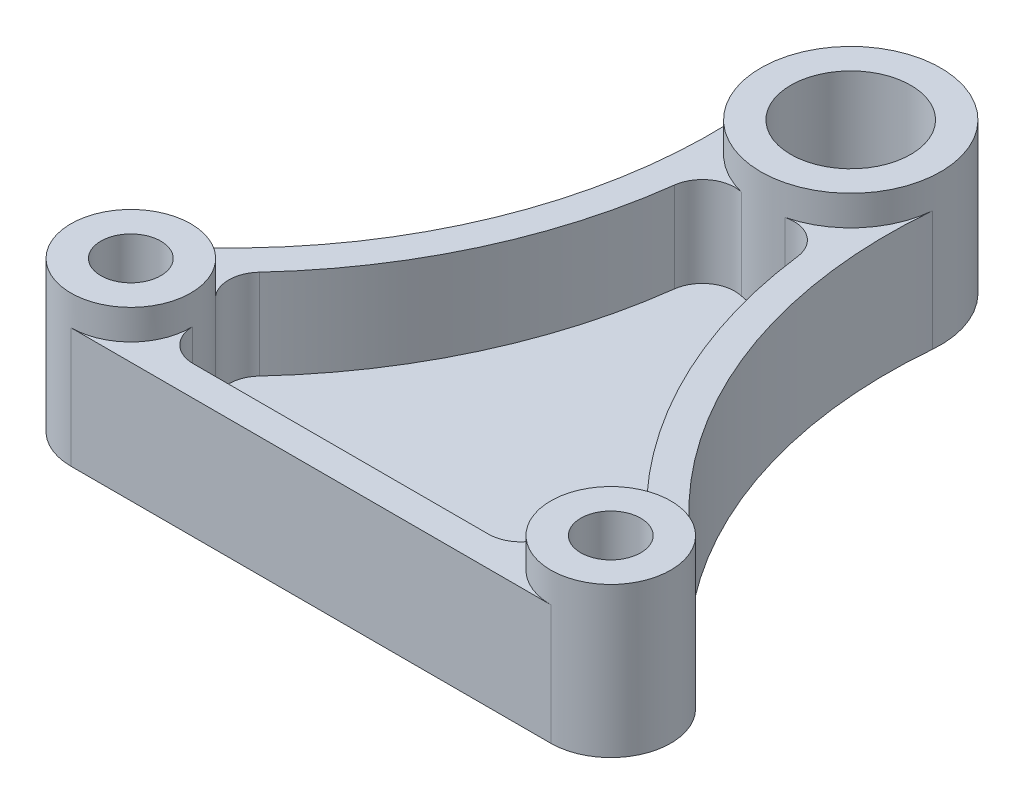
ISO-10303-21;
HEADER;
FILE_DESCRIPTION(('STEP AP214'),'2;1');
FILE_NAME('part.step','',(''),(''),'','','');
FILE_SCHEMA(('AUTOMOTIVE_DESIGN { 1 0 10303 214 1 1 1 1 }'));
ENDSEC;
DATA;
#1=APPLICATION_CONTEXT('core data for automotive mechanical design processes');
#2=APPLICATION_PROTOCOL_DEFINITION('international standard','automotive_design',2000,#1);
#3=PRODUCT_CONTEXT('',#1,'mechanical');
#4=PRODUCT('Part','Part','',(#3));
#5=PRODUCT_RELATED_PRODUCT_CATEGORY('part','',(#4));
#6=PRODUCT_DEFINITION_FORMATION('','',#4);
#7=PRODUCT_DEFINITION_CONTEXT('part definition',#1,'design');
#8=PRODUCT_DEFINITION('design','',#6,#7);
#9=PRODUCT_DEFINITION_SHAPE('','',#8);
#10=(LENGTH_UNIT() NAMED_UNIT(*) SI_UNIT(.MILLI.,.METRE.));
#11=(NAMED_UNIT(*) PLANE_ANGLE_UNIT() SI_UNIT($,.RADIAN.));
#12=(NAMED_UNIT(*) SI_UNIT($,.STERADIAN.) SOLID_ANGLE_UNIT());
#13=UNCERTAINTY_MEASURE_WITH_UNIT(LENGTH_MEASURE(1.E-05),#10,'distance_accuracy_value','');
#14=(GEOMETRIC_REPRESENTATION_CONTEXT(3) GLOBAL_UNCERTAINTY_ASSIGNED_CONTEXT((#13)) GLOBAL_UNIT_ASSIGNED_CONTEXT((#10,
#11,#12)) REPRESENTATION_CONTEXT('',''));
#15=CARTESIAN_POINT('',(0.,0.,0.));
#16=DIRECTION('',(0.,0.,1.));
#17=DIRECTION('',(1.,0.,0.));
#18=AXIS2_PLACEMENT_3D('',#15,#16,#17);
#19=CARTESIAN_POINT('',(-60.0847310703044,12.7,5.37872821484782));
#20=DIRECTION('',(0.,1.,0.));
#21=DIRECTION('',(0.,0.,1.));
#22=AXIS2_PLACEMENT_3D('',#19,#20,#21);
#23=PLANE('',#22);
#24=DIRECTION('',(1.,0.,0.));
#25=VECTOR('',#24,1.);
#26=CARTESIAN_POINT('',(-25.4,12.7,53.975));
#27=LINE('',#26,#25);
#28=CARTESIAN_POINT('',(-15.6242992578537,12.7,53.975));
#29=VERTEX_POINT('',#28);
#30=CARTESIAN_POINT('',(15.6242992578537,12.7,53.975));
#31=VERTEX_POINT('',#30);
#32=EDGE_CURVE('E311',#29,#31,#27,.T.);
#33=ORIENTED_EDGE('',*,*,#32,.F.);
#34=CARTESIAN_POINT('',(-15.6242992578537,12.7,50.546));
#35=DIRECTION('',(0.,1.,0.));
#36=DIRECTION('',(0.,0.,1.));
#37=AXIS2_PLACEMENT_3D('',#34,#35,#36);
#38=CIRCLE('',#37,3.429);
#39=CARTESIAN_POINT('',(-19.0521423752297,12.7,50.6350649350649));
#40=VERTEX_POINT('',#39);
#41=EDGE_CURVE('E292',#29,#40,#38,.F.);
#42=ORIENTED_EDGE('',*,*,#41,.T.);
#43=CARTESIAN_POINT('',(-25.4,12.7,50.8));
#44=DIRECTION('',(0.,1.,0.));
#45=DIRECTION('',(0.,0.,1.));
#46=AXIS2_PLACEMENT_3D('',#43,#44,#45);
#47=CIRCLE('',#46,6.35);
#48=CARTESIAN_POINT('',(-25.4,12.7,57.15));
#49=VERTEX_POINT('',#48);
#50=EDGE_CURVE('E346',#49,#40,#47,.T.);
#51=ORIENTED_EDGE('',*,*,#50,.F.);
#52=DIRECTION('',(1.,0.,0.));
#53=VECTOR('',#52,1.);
#54=CARTESIAN_POINT('',(-25.4,12.7,57.15));
#55=LINE('',#54,#53);
#56=CARTESIAN_POINT('',(25.4,12.7,57.15));
#57=VERTEX_POINT('',#56);
#58=EDGE_CURVE('E199',#49,#57,#55,.T.);
#59=ORIENTED_EDGE('',*,*,#58,.T.);
#60=CARTESIAN_POINT('',(25.4,12.7,50.8));
#61=DIRECTION('',(0.,1.,0.));
#62=DIRECTION('',(0.,0.,1.));
#63=AXIS2_PLACEMENT_3D('',#60,#61,#62);
#64=CIRCLE('',#63,6.35);
#65=CARTESIAN_POINT('',(19.0521423752297,12.7,50.6350649350649));
#66=VERTEX_POINT('',#65);
#67=EDGE_CURVE('E358',#57,#66,#64,.F.);
#68=ORIENTED_EDGE('',*,*,#67,.T.);
#69=CARTESIAN_POINT('',(15.6242992578537,12.7,50.546));
#70=DIRECTION('',(0.,1.,0.));
#71=DIRECTION('',(0.,0.,1.));
#72=AXIS2_PLACEMENT_3D('',#69,#70,#71);
#73=CIRCLE('',#72,3.429);
#74=EDGE_CURVE('E286',#66,#31,#73,.F.);
#75=ORIENTED_EDGE('',*,*,#74,.T.);
#76=EDGE_LOOP('',(#33,#42,#51,#59,#68,#75));
#77=FACE_BOUND('',#76,.T.);
#78=ADVANCED_FACE('F52',(#77),#23,.T.);
#79=CARTESIAN_POINT('',(60.0847310703044,12.7,5.37872821484781));
#80=DIRECTION('',(0.,1.,0.));
#81=DIRECTION('',(0.,0.,1.));
#82=AXIS2_PLACEMENT_3D('',#79,#80,#81);
#83=CIRCLE('',#82,53.975);
#84=CARTESIAN_POINT('',(20.509178492168,12.7,42.0812657720136));
#85=VERTEX_POINT('',#84);
#86=CARTESIAN_POINT('',(6.53487642210372,12.7,12.1399183583495));
#87=VERTEX_POINT('',#86);
#88=EDGE_CURVE('E300',#85,#87,#83,.F.);
#89=ORIENTED_EDGE('',*,*,#88,.F.);
#90=CARTESIAN_POINT('',(17.9949669166158,12.7,44.4129563932923));
#91=DIRECTION('',(0.,1.,0.));
#92=DIRECTION('',(0.,0.,1.));
#93=AXIS2_PLACEMENT_3D('',#90,#91,#92);
#94=CIRCLE('',#93,3.429);
#95=CARTESIAN_POINT('',(20.5915369588414,12.7,46.6525690865535));
#96=VERTEX_POINT('',#95);
#97=EDGE_CURVE('E296',#85,#96,#94,.F.);
#98=ORIENTED_EDGE('',*,*,#97,.T.);
#99=CARTESIAN_POINT('',(29.2538590078116,12.7,45.753192023872));
#100=VERTEX_POINT('',#99);
#101=EDGE_CURVE('E193',#96,#100,#64,.F.);
#102=ORIENTED_EDGE('',*,*,#101,.T.);
#103=CARTESIAN_POINT('',(60.0847310703044,12.7,5.37872821484781));
#104=DIRECTION('',(0.,-1.,0.));
#105=DIRECTION('',(0.,0.,1.));
#106=AXIS2_PLACEMENT_3D('',#103,#104,#105);
#107=CIRCLE('',#106,50.8);
#108=CARTESIAN_POINT('',(9.48706280057436,12.7,0.849272876028603));
#109=VERTEX_POINT('',#108);
#110=EDGE_CURVE('E189',#100,#109,#107,.T.);
#111=ORIENTED_EDGE('',*,*,#110,.T.);
#112=CARTESIAN_POINT('',(0.,12.7,0.));
#113=DIRECTION('',(0.,1.,0.));
#114=DIRECTION('',(0.,0.,1.));
#115=AXIS2_PLACEMENT_3D('',#112,#113,#114);
#116=CIRCLE('',#115,9.525);
#117=CARTESIAN_POINT('',(2.30359239427797,12.7,9.24224469926136));
#118=VERTEX_POINT('',#117);
#119=EDGE_CURVE('E68',#109,#118,#116,.F.);
#120=ORIENTED_EDGE('',*,*,#119,.T.);
#121=CARTESIAN_POINT('',(3.13288565621804,12.7,12.5694527909955));
#122=DIRECTION('',(0.,1.,0.));
#123=DIRECTION('',(0.,0.,1.));
#124=AXIS2_PLACEMENT_3D('',#121,#122,#123);
#125=CIRCLE('',#124,3.429);
#126=EDGE_CURVE('E61',#118,#87,#125,.F.);
#127=ORIENTED_EDGE('',*,*,#126,.T.);
#128=EDGE_LOOP('',(#89,#98,#102,#111,#120,#127));
#129=FACE_BOUND('',#128,.T.);
#130=ADVANCED_FACE('F191',(#129),#23,.T.);
#131=CARTESIAN_POINT('',(-60.0847310703044,12.7,5.37872821484782));
#132=DIRECTION('',(0.,1.,0.));
#133=DIRECTION('',(0.,0.,1.));
#134=AXIS2_PLACEMENT_3D('',#131,#132,#133);
#135=CIRCLE('',#134,53.975);
#136=CARTESIAN_POINT('',(-6.53487642210372,12.7,12.1399183583494));
#137=VERTEX_POINT('',#136);
#138=CARTESIAN_POINT('',(-20.509178492168,12.7,42.0812657720136));
#139=VERTEX_POINT('',#138);
#140=EDGE_CURVE('E442',#137,#139,#135,.F.);
#141=ORIENTED_EDGE('',*,*,#140,.F.);
#142=CARTESIAN_POINT('',(-3.13288565621804,12.7,12.5694527909954));
#143=DIRECTION('',(0.,1.,0.));
#144=DIRECTION('',(0.,0.,1.));
#145=AXIS2_PLACEMENT_3D('',#142,#143,#144);
#146=CIRCLE('',#145,3.429);
#147=CARTESIAN_POINT('',(-2.30359239427797,12.7,9.24224469926136));
#148=VERTEX_POINT('',#147);
#149=EDGE_CURVE('E12',#137,#148,#146,.F.);
#150=ORIENTED_EDGE('',*,*,#149,.T.);
#151=CARTESIAN_POINT('',(-9.48706280057436,12.7,0.849272876028608));
#152=VERTEX_POINT('',#151);
#153=EDGE_CURVE('E76',#148,#152,#116,.F.);
#154=ORIENTED_EDGE('',*,*,#153,.T.);
#155=CARTESIAN_POINT('',(-60.0847310703044,12.7,5.37872821484782));
#156=DIRECTION('',(0.,-1.,0.));
#157=DIRECTION('',(0.,0.,1.));
#158=AXIS2_PLACEMENT_3D('',#155,#156,#157);
#159=CIRCLE('',#158,50.8);
#160=CARTESIAN_POINT('',(-29.2538590078116,12.7,45.753192023872));
#161=VERTEX_POINT('',#160);
#162=EDGE_CURVE('E387',#152,#161,#159,.T.);
#163=ORIENTED_EDGE('',*,*,#162,.T.);
#164=CARTESIAN_POINT('',(-20.5915369588414,12.7,46.6525690865535));
#165=VERTEX_POINT('',#164);
#166=EDGE_CURVE('E352',#165,#161,#47,.T.);
#167=ORIENTED_EDGE('',*,*,#166,.F.);
#168=CARTESIAN_POINT('',(-17.9949669166158,12.7,44.4129563932923));
#169=DIRECTION('',(0.,1.,0.));
#170=DIRECTION('',(0.,0.,1.));
#171=AXIS2_PLACEMENT_3D('',#168,#169,#170);
#172=CIRCLE('',#171,3.429);
#173=EDGE_CURVE('E289',#165,#139,#172,.F.);
#174=ORIENTED_EDGE('',*,*,#173,.T.);
#175=EDGE_LOOP('',(#141,#150,#154,#163,#167,#174));
#176=FACE_BOUND('',#175,.T.);
#177=ADVANCED_FACE('F472',(#176),#23,.T.);
#178=CARTESIAN_POINT('',(-60.0847310703044,12.7,5.37872821484782));
#179=DIRECTION('',(0.,-1.,0.));
#180=DIRECTION('',(0.,0.,-1.));
#181=AXIS2_PLACEMENT_3D('',#178,#179,#180);
#182=CYLINDRICAL_SURFACE('',#181,50.8);
#183=CARTESIAN_POINT('',(-60.0847310703044,0.,5.37872821484782));
#184=DIRECTION('',(0.,-1.,0.));
#185=DIRECTION('',(0.,0.,1.));
#186=AXIS2_PLACEMENT_3D('',#183,#184,#185);
#187=CIRCLE('',#186,50.8);
#188=CARTESIAN_POINT('',(-9.48706280057436,0.,0.849272876028608));
#189=VERTEX_POINT('',#188);
#190=CARTESIAN_POINT('',(-29.2538590078116,0.,45.753192023872));
#191=VERTEX_POINT('',#190);
#192=EDGE_CURVE('E371',#189,#191,#187,.T.);
#193=ORIENTED_EDGE('',*,*,#192,.T.);
#194=DIRECTION('',(0.,-1.,0.));
#195=VECTOR('',#194,1.);
#196=CARTESIAN_POINT('',(-29.2538590078116,12.7,45.753192023872));
#197=LINE('',#196,#195);
#198=EDGE_CURVE('E222',#161,#191,#197,.T.);
#199=ORIENTED_EDGE('',*,*,#198,.F.);
#200=ORIENTED_EDGE('',*,*,#162,.F.);
#201=DIRECTION('',(0.,-1.,0.));
#202=VECTOR('',#201,1.);
#203=CARTESIAN_POINT('',(-9.48706280057436,12.7,0.849272876028608));
#204=LINE('',#203,#202);
#205=EDGE_CURVE('E198',#152,#189,#204,.T.);
#206=ORIENTED_EDGE('',*,*,#205,.T.);
#207=EDGE_LOOP('',(#193,#199,#200,#206));
#208=FACE_BOUND('',#207,.T.);
#209=ADVANCED_FACE('F480',(#208),#182,.F.);
#210=CARTESIAN_POINT('',(-25.4,12.7,50.8));
#211=DIRECTION('',(0.,-1.,0.));
#212=DIRECTION('',(0.,0.,-1.));
#213=AXIS2_PLACEMENT_3D('',#210,#211,#212);
#214=CYLINDRICAL_SURFACE('',#213,6.34999999999999);
#215=CARTESIAN_POINT('',(-25.4,3.175,50.8));
#216=DIRECTION('',(0.,1.,0.));
#217=DIRECTION('',(0.,0.,1.));
#218=AXIS2_PLACEMENT_3D('',#215,#216,#217);
#219=CIRCLE('',#218,6.35);
#220=CARTESIAN_POINT('',(-19.0521423752297,3.175,50.6350649350649));
#221=VERTEX_POINT('',#220);
#222=CARTESIAN_POINT('',(-20.5915369588414,3.175,46.6525690865535));
#223=VERTEX_POINT('',#222);
#224=EDGE_CURVE('E323',#221,#223,#219,.T.);
#225=ORIENTED_EDGE('',*,*,#224,.T.);
#226=DIRECTION('',(0.,-1.,0.));
#227=VECTOR('',#226,1.);
#228=CARTESIAN_POINT('',(-20.5915369588414,12.7,46.6525690865535));
#229=LINE('',#228,#227);
#230=EDGE_CURVE('E270',#223,#165,#229,.F.);
#231=ORIENTED_EDGE('',*,*,#230,.T.);
#232=ORIENTED_EDGE('',*,*,#166,.T.);
#233=ORIENTED_EDGE('',*,*,#198,.T.);
#234=CARTESIAN_POINT('',(-25.4,0.,50.8));
#235=DIRECTION('',(0.,1.,0.));
#236=DIRECTION('',(0.,0.,1.));
#237=AXIS2_PLACEMENT_3D('',#234,#235,#236);
#238=CIRCLE('',#237,6.34999999999999);
#239=CARTESIAN_POINT('',(-25.4,0.,57.15));
#240=VERTEX_POINT('',#239);
#241=EDGE_CURVE('E375',#191,#240,#238,.T.);
#242=ORIENTED_EDGE('',*,*,#241,.T.);
#243=DIRECTION('',(0.,-1.,0.));
#244=VECTOR('',#243,1.);
#245=CARTESIAN_POINT('',(-25.4,12.7,57.15));
#246=LINE('',#245,#244);
#247=EDGE_CURVE('E218',#49,#240,#246,.T.);
#248=ORIENTED_EDGE('',*,*,#247,.F.);
#249=ORIENTED_EDGE('',*,*,#50,.T.);
#250=DIRECTION('',(0.,-1.,0.));
#251=VECTOR('',#250,1.);
#252=CARTESIAN_POINT('',(-19.0521423752297,12.7,50.6350649350649));
#253=LINE('',#252,#251);
#254=EDGE_CURVE('E266',#40,#221,#253,.T.);
#255=ORIENTED_EDGE('',*,*,#254,.T.);
#256=EDGE_LOOP('',(#225,#231,#232,#233,#242,#248,#249,#255));
#257=FACE_BOUND('',#256,.T.);
#258=CARTESIAN_POINT('',(-25.4,15.875,50.8));
#259=DIRECTION('',(0.,-1.,0.));
#260=DIRECTION('',(0.,0.,-1.));
#261=AXIS2_PLACEMENT_3D('',#258,#259,#260);
#262=CIRCLE('',#261,6.35);
#263=CARTESIAN_POINT('',(-25.4,15.875,44.45));
#264=VERTEX_POINT('',#263);
#265=EDGE_CURVE('E186',#264,#264,#262,.T.);
#266=ORIENTED_EDGE('',*,*,#265,.T.);
#267=EDGE_LOOP('',(#266));
#268=FACE_BOUND('',#267,.T.);
#269=ADVANCED_FACE('F485',(#257,#268),#214,.T.);
#270=CARTESIAN_POINT('',(-25.4,12.7,57.15));
#271=DIRECTION('',(0.,0.,-1.));
#272=DIRECTION('',(-1.,0.,0.));
#273=AXIS2_PLACEMENT_3D('',#270,#271,#272);
#274=PLANE('',#273);
#275=DIRECTION('',(1.,0.,0.));
#276=VECTOR('',#275,1.);
#277=CARTESIAN_POINT('',(-25.4,0.,57.15));
#278=LINE('',#277,#276);
#279=CARTESIAN_POINT('',(25.4,0.,57.15));
#280=VERTEX_POINT('',#279);
#281=EDGE_CURVE('E378',#240,#280,#278,.T.);
#282=ORIENTED_EDGE('',*,*,#281,.T.);
#283=DIRECTION('',(0.,-1.,0.));
#284=VECTOR('',#283,1.);
#285=CARTESIAN_POINT('',(25.4,12.7,57.15));
#286=LINE('',#285,#284);
#287=EDGE_CURVE('E209',#57,#280,#286,.T.);
#288=ORIENTED_EDGE('',*,*,#287,.F.);
#289=ORIENTED_EDGE('',*,*,#58,.F.);
#290=ORIENTED_EDGE('',*,*,#247,.T.);
#291=EDGE_LOOP('',(#282,#288,#289,#290));
#292=FACE_BOUND('',#291,.T.);
#293=ADVANCED_FACE('F401',(#292),#274,.F.);
#294=CARTESIAN_POINT('',(25.4,12.7,50.8));
#295=DIRECTION('',(0.,-1.,0.));
#296=DIRECTION('',(0.,0.,-1.));
#297=AXIS2_PLACEMENT_3D('',#294,#295,#296);
#298=CYLINDRICAL_SURFACE('',#297,6.35);
#299=CARTESIAN_POINT('',(25.4,3.175,50.8));
#300=DIRECTION('',(0.,1.,0.));
#301=DIRECTION('',(0.,0.,1.));
#302=AXIS2_PLACEMENT_3D('',#299,#300,#301);
#303=CIRCLE('',#302,6.35);
#304=CARTESIAN_POINT('',(20.5915369588414,3.175,46.6525690865535));
#305=VERTEX_POINT('',#304);
#306=CARTESIAN_POINT('',(19.0521423752297,3.175,50.6350649350649));
#307=VERTEX_POINT('',#306);
#308=EDGE_CURVE('E331',#305,#307,#303,.T.);
#309=ORIENTED_EDGE('',*,*,#308,.T.);
#310=DIRECTION('',(0.,-1.,0.));
#311=VECTOR('',#310,1.);
#312=CARTESIAN_POINT('',(19.0521423752297,12.7,50.6350649350649));
#313=LINE('',#312,#311);
#314=EDGE_CURVE('E255',#307,#66,#313,.F.);
#315=ORIENTED_EDGE('',*,*,#314,.T.);
#316=ORIENTED_EDGE('',*,*,#67,.F.);
#317=ORIENTED_EDGE('',*,*,#287,.T.);
#318=CARTESIAN_POINT('',(25.4,0.,50.8));
#319=DIRECTION('',(0.,1.,0.));
#320=DIRECTION('',(0.,0.,1.));
#321=AXIS2_PLACEMENT_3D('',#318,#319,#320);
#322=CIRCLE('',#321,6.35);
#323=CARTESIAN_POINT('',(29.2538590078116,0.,45.753192023872));
#324=VERTEX_POINT('',#323);
#325=EDGE_CURVE('E381',#280,#324,#322,.T.);
#326=ORIENTED_EDGE('',*,*,#325,.T.);
#327=DIRECTION('',(0.,-1.,0.));
#328=VECTOR('',#327,1.);
#329=CARTESIAN_POINT('',(29.2538590078116,12.7,45.753192023872));
#330=LINE('',#329,#328);
#331=EDGE_CURVE('E205',#100,#324,#330,.T.);
#332=ORIENTED_EDGE('',*,*,#331,.F.);
#333=ORIENTED_EDGE('',*,*,#101,.F.);
#334=DIRECTION('',(0.,-1.,0.));
#335=VECTOR('',#334,1.);
#336=CARTESIAN_POINT('',(20.5915369588414,12.7,46.6525690865535));
#337=LINE('',#336,#335);
#338=EDGE_CURVE('E251',#96,#305,#337,.T.);
#339=ORIENTED_EDGE('',*,*,#338,.T.);
#340=EDGE_LOOP('',(#309,#315,#316,#317,#326,#332,#333,#339));
#341=FACE_BOUND('',#340,.T.);
#342=CARTESIAN_POINT('',(25.4,15.875,50.8));
#343=DIRECTION('',(0.,1.,0.));
#344=DIRECTION('',(0.,0.,1.));
#345=AXIS2_PLACEMENT_3D('',#342,#343,#344);
#346=CIRCLE('',#345,6.35);
#347=CARTESIAN_POINT('',(25.4,15.875,57.15));
#348=VERTEX_POINT('',#347);
#349=EDGE_CURVE('E351',#348,#348,#346,.T.);
#350=ORIENTED_EDGE('',*,*,#349,.F.);
#351=EDGE_LOOP('',(#350));
#352=FACE_BOUND('',#351,.T.);
#353=ADVANCED_FACE('F406',(#341,#352),#298,.T.);
#354=CARTESIAN_POINT('',(60.0847310703044,12.7,5.37872821484781));
#355=DIRECTION('',(0.,-1.,0.));
#356=DIRECTION('',(0.,0.,-1.));
#357=AXIS2_PLACEMENT_3D('',#354,#355,#356);
#358=CYLINDRICAL_SURFACE('',#357,50.8);
#359=CARTESIAN_POINT('',(60.0847310703044,0.,5.37872821484781));
#360=DIRECTION('',(0.,-1.,0.));
#361=DIRECTION('',(0.,0.,1.));
#362=AXIS2_PLACEMENT_3D('',#359,#360,#361);
#363=CIRCLE('',#362,50.8);
#364=CARTESIAN_POINT('',(9.48706280057436,0.,0.849272876028585));
#365=VERTEX_POINT('',#364);
#366=EDGE_CURVE('E203',#324,#365,#363,.T.);
#367=ORIENTED_EDGE('',*,*,#366,.T.);
#368=DIRECTION('',(0.,-1.,0.));
#369=VECTOR('',#368,1.);
#370=CARTESIAN_POINT('',(9.48706280057436,12.7,0.849272876028585));
#371=LINE('',#370,#369);
#372=EDGE_CURVE('E180',#109,#365,#371,.T.);
#373=ORIENTED_EDGE('',*,*,#372,.F.);
#374=ORIENTED_EDGE('',*,*,#110,.F.);
#375=ORIENTED_EDGE('',*,*,#331,.T.);
#376=EDGE_LOOP('',(#367,#373,#374,#375));
#377=FACE_BOUND('',#376,.T.);
#378=ADVANCED_FACE('F201',(#377),#358,.F.);
#379=CARTESIAN_POINT('',(0.,12.7,0.));
#380=DIRECTION('',(0.,-1.,0.));
#381=DIRECTION('',(0.,0.,-1.));
#382=AXIS2_PLACEMENT_3D('',#379,#380,#381);
#383=CYLINDRICAL_SURFACE('',#382,9.52499999999998);
#384=CARTESIAN_POINT('',(0.,3.175,0.));
#385=DIRECTION('',(0.,1.,0.));
#386=DIRECTION('',(0.,0.,1.));
#387=AXIS2_PLACEMENT_3D('',#384,#385,#386);
#388=CIRCLE('',#387,9.525);
#389=CARTESIAN_POINT('',(-2.30359239427797,3.175,9.24224469926136));
#390=VERTEX_POINT('',#389);
#391=CARTESIAN_POINT('',(2.30359239427797,3.175,9.24224469926136));
#392=VERTEX_POINT('',#391);
#393=EDGE_CURVE('E318',#390,#392,#388,.T.);
#394=ORIENTED_EDGE('',*,*,#393,.T.);
#395=DIRECTION('',(0.,-1.,0.));
#396=VECTOR('',#395,1.);
#397=CARTESIAN_POINT('',(2.30359239427797,12.7,9.24224469926135));
#398=LINE('',#397,#396);
#399=EDGE_CURVE('E183',#392,#118,#398,.F.);
#400=ORIENTED_EDGE('',*,*,#399,.T.);
#401=ORIENTED_EDGE('',*,*,#119,.F.);
#402=ORIENTED_EDGE('',*,*,#372,.T.);
#403=CARTESIAN_POINT('',(0.,0.,0.));
#404=DIRECTION('',(0.,1.,0.));
#405=DIRECTION('',(0.,0.,1.));
#406=AXIS2_PLACEMENT_3D('',#403,#404,#405);
#407=CIRCLE('',#406,9.52499999999998);
#408=EDGE_CURVE('E385',#365,#189,#407,.T.);
#409=ORIENTED_EDGE('',*,*,#408,.T.);
#410=ORIENTED_EDGE('',*,*,#205,.F.);
#411=ORIENTED_EDGE('',*,*,#153,.F.);
#412=DIRECTION('',(0.,-1.,0.));
#413=VECTOR('',#412,1.);
#414=CARTESIAN_POINT('',(-2.30359239427797,12.7,9.24224469926134));
#415=LINE('',#414,#413);
#416=EDGE_CURVE('E281',#148,#390,#415,.T.);
#417=ORIENTED_EDGE('',*,*,#416,.T.);
#418=EDGE_LOOP('',(#394,#400,#401,#402,#409,#410,#411,#417));
#419=FACE_BOUND('',#418,.T.);
#420=CARTESIAN_POINT('',(0.,15.875,0.));
#421=DIRECTION('',(0.,1.,0.));
#422=DIRECTION('',(0.,0.,1.));
#423=AXIS2_PLACEMENT_3D('',#420,#421,#422);
#424=CIRCLE('',#423,9.525);
#425=CARTESIAN_POINT('',(0.,15.875,9.525));
#426=VERTEX_POINT('',#425);
#427=EDGE_CURVE('E417',#426,#426,#424,.T.);
#428=ORIENTED_EDGE('',*,*,#427,.F.);
#429=EDGE_LOOP('',(#428));
#430=FACE_BOUND('',#429,.T.);
#431=ADVANCED_FACE('F177',(#419,#430),#383,.T.);
#432=CARTESIAN_POINT('',(-60.0847310703044,0.,5.37872821484782));
#433=DIRECTION('',(0.,1.,0.));
#434=DIRECTION('',(0.,0.,1.));
#435=AXIS2_PLACEMENT_3D('',#432,#433,#434);
#436=PLANE('',#435);
#437=CARTESIAN_POINT('',(0.,0.,0.));
#438=DIRECTION('',(0.,1.,0.));
#439=DIRECTION('',(0.,0.,1.));
#440=AXIS2_PLACEMENT_3D('',#437,#438,#439);
#441=CIRCLE('',#440,6.35);
#442=CARTESIAN_POINT('',(0.,0.,6.35));
#443=VERTEX_POINT('',#442);
#444=EDGE_CURVE('E423',#443,#443,#441,.T.);
#445=ORIENTED_EDGE('',*,*,#444,.T.);
#446=EDGE_LOOP('',(#445));
#447=FACE_BOUND('',#446,.T.);
#448=CARTESIAN_POINT('',(-25.4,0.,50.8));
#449=DIRECTION('',(0.,1.,0.));
#450=DIRECTION('',(0.,0.,1.));
#451=AXIS2_PLACEMENT_3D('',#448,#449,#450);
#452=CIRCLE('',#451,3.175);
#453=CARTESIAN_POINT('',(-25.4,0.,53.975));
#454=VERTEX_POINT('',#453);
#455=EDGE_CURVE('E427',#454,#454,#452,.T.);
#456=ORIENTED_EDGE('',*,*,#455,.T.);
#457=EDGE_LOOP('',(#456));
#458=FACE_BOUND('',#457,.T.);
#459=CARTESIAN_POINT('',(25.4,0.,50.8));
#460=DIRECTION('',(0.,1.,0.));
#461=DIRECTION('',(0.,0.,1.));
#462=AXIS2_PLACEMENT_3D('',#459,#460,#461);
#463=CIRCLE('',#462,3.175);
#464=CARTESIAN_POINT('',(25.4,0.,53.975));
#465=VERTEX_POINT('',#464);
#466=EDGE_CURVE('E434',#465,#465,#463,.T.);
#467=ORIENTED_EDGE('',*,*,#466,.T.);
#468=EDGE_LOOP('',(#467));
#469=FACE_BOUND('',#468,.T.);
#470=ORIENTED_EDGE('',*,*,#192,.F.);
#471=ORIENTED_EDGE('',*,*,#408,.F.);
#472=ORIENTED_EDGE('',*,*,#366,.F.);
#473=ORIENTED_EDGE('',*,*,#325,.F.);
#474=ORIENTED_EDGE('',*,*,#281,.F.);
#475=ORIENTED_EDGE('',*,*,#241,.F.);
#476=EDGE_LOOP('',(#470,#471,#472,#473,#474,#475));
#477=FACE_BOUND('',#476,.T.);
#478=ADVANCED_FACE('F501',(#447,#458,#469,#477),#436,.F.);
#479=CARTESIAN_POINT('',(25.4,15.875,50.8));
#480=DIRECTION('',(0.,1.,0.));
#481=DIRECTION('',(0.,0.,1.));
#482=AXIS2_PLACEMENT_3D('',#479,#480,#481);
#483=PLANE('',#482);
#484=CARTESIAN_POINT('',(25.4,15.875,50.8));
#485=DIRECTION('',(0.,1.,0.));
#486=DIRECTION('',(0.,0.,1.));
#487=AXIS2_PLACEMENT_3D('',#484,#485,#486);
#488=CIRCLE('',#487,3.175);
#489=CARTESIAN_POINT('',(25.4,15.875,53.975));
#490=VERTEX_POINT('',#489);
#491=EDGE_CURVE('E310',#490,#490,#488,.T.);
#492=ORIENTED_EDGE('',*,*,#491,.F.);
#493=EDGE_LOOP('',(#492));
#494=FACE_BOUND('',#493,.T.);
#495=ORIENTED_EDGE('',*,*,#349,.T.);
#496=EDGE_LOOP('',(#495));
#497=FACE_BOUND('',#496,.T.);
#498=ADVANCED_FACE('F607',(#494,#497),#483,.T.);
#499=CARTESIAN_POINT('',(-25.4,15.875,50.8));
#500=DIRECTION('',(0.,-1.,0.));
#501=DIRECTION('',(0.,0.,-1.));
#502=AXIS2_PLACEMENT_3D('',#499,#500,#501);
#503=PLANE('',#502);
#504=CARTESIAN_POINT('',(-25.4,15.875,50.8));
#505=DIRECTION('',(0.,1.,0.));
#506=DIRECTION('',(0.,0.,1.));
#507=AXIS2_PLACEMENT_3D('',#504,#505,#506);
#508=CIRCLE('',#507,3.175);
#509=CARTESIAN_POINT('',(-25.4,15.875,53.975));
#510=VERTEX_POINT('',#509);
#511=EDGE_CURVE('E430',#510,#510,#508,.T.);
#512=ORIENTED_EDGE('',*,*,#511,.F.);
#513=EDGE_LOOP('',(#512));
#514=FACE_BOUND('',#513,.T.);
#515=ORIENTED_EDGE('',*,*,#265,.F.);
#516=EDGE_LOOP('',(#515));
#517=FACE_BOUND('',#516,.T.);
#518=ADVANCED_FACE('F615',(#514,#517),#503,.F.);
#519=CARTESIAN_POINT('',(0.,15.875,0.));
#520=DIRECTION('',(0.,1.,0.));
#521=DIRECTION('',(0.,0.,1.));
#522=AXIS2_PLACEMENT_3D('',#519,#520,#521);
#523=PLANE('',#522);
#524=CARTESIAN_POINT('',(0.,15.875,0.));
#525=DIRECTION('',(0.,1.,0.));
#526=DIRECTION('',(0.,0.,1.));
#527=AXIS2_PLACEMENT_3D('',#524,#525,#526);
#528=CIRCLE('',#527,6.35);
#529=CARTESIAN_POINT('',(0.,15.875,6.35));
#530=VERTEX_POINT('',#529);
#531=EDGE_CURVE('E420',#530,#530,#528,.T.);
#532=ORIENTED_EDGE('',*,*,#531,.F.);
#533=EDGE_LOOP('',(#532));
#534=FACE_BOUND('',#533,.T.);
#535=ORIENTED_EDGE('',*,*,#427,.T.);
#536=EDGE_LOOP('',(#535));
#537=FACE_BOUND('',#536,.T.);
#538=ADVANCED_FACE('F623',(#534,#537),#523,.T.);
#539=CARTESIAN_POINT('',(0.,15.875,0.));
#540=DIRECTION('',(0.,-1.,0.));
#541=DIRECTION('',(0.,0.,-1.));
#542=AXIS2_PLACEMENT_3D('',#539,#540,#541);
#543=CYLINDRICAL_SURFACE('',#542,6.35);
#544=ORIENTED_EDGE('',*,*,#531,.T.);
#545=EDGE_LOOP('',(#544));
#546=FACE_BOUND('',#545,.T.);
#547=ORIENTED_EDGE('',*,*,#444,.F.);
#548=EDGE_LOOP('',(#547));
#549=FACE_BOUND('',#548,.T.);
#550=ADVANCED_FACE('F632',(#546,#549),#543,.F.);
#551=CARTESIAN_POINT('',(-25.4,15.875,50.8));
#552=DIRECTION('',(0.,-1.,0.));
#553=DIRECTION('',(0.,0.,-1.));
#554=AXIS2_PLACEMENT_3D('',#551,#552,#553);
#555=CYLINDRICAL_SURFACE('',#554,3.175);
#556=ORIENTED_EDGE('',*,*,#511,.T.);
#557=EDGE_LOOP('',(#556));
#558=FACE_BOUND('',#557,.T.);
#559=ORIENTED_EDGE('',*,*,#455,.F.);
#560=EDGE_LOOP('',(#559));
#561=FACE_BOUND('',#560,.T.);
#562=ADVANCED_FACE('F641',(#558,#561),#555,.F.);
#563=CARTESIAN_POINT('',(25.4,15.875,50.8));
#564=DIRECTION('',(0.,-1.,0.));
#565=DIRECTION('',(0.,0.,-1.));
#566=AXIS2_PLACEMENT_3D('',#563,#564,#565);
#567=CYLINDRICAL_SURFACE('',#566,3.175);
#568=ORIENTED_EDGE('',*,*,#491,.T.);
#569=EDGE_LOOP('',(#568));
#570=FACE_BOUND('',#569,.T.);
#571=ORIENTED_EDGE('',*,*,#466,.F.);
#572=EDGE_LOOP('',(#571));
#573=FACE_BOUND('',#572,.T.);
#574=ADVANCED_FACE('F546',(#570,#573),#567,.F.);
#575=CARTESIAN_POINT('',(-60.0847310703044,12.7,5.37872821484782));
#576=DIRECTION('',(0.,-1.,0.));
#577=DIRECTION('',(0.,0.,-1.));
#578=AXIS2_PLACEMENT_3D('',#575,#576,#577);
#579=CYLINDRICAL_SURFACE('',#578,53.975);
#580=ORIENTED_EDGE('',*,*,#140,.T.);
#581=DIRECTION('',(0.,-1.,0.));
#582=VECTOR('',#581,1.);
#583=CARTESIAN_POINT('',(-20.509178492168,12.7,42.0812657720136));
#584=LINE('',#583,#582);
#585=CARTESIAN_POINT('',(-20.509178492168,3.175,42.0812657720136));
#586=VERTEX_POINT('',#585);
#587=EDGE_CURVE('E262',#139,#586,#584,.T.);
#588=ORIENTED_EDGE('',*,*,#587,.T.);
#589=CARTESIAN_POINT('',(-60.0847310703044,3.175,5.37872821484782));
#590=DIRECTION('',(0.,1.,0.));
#591=DIRECTION('',(0.,0.,1.));
#592=AXIS2_PLACEMENT_3D('',#589,#590,#591);
#593=CIRCLE('',#592,53.975);
#594=CARTESIAN_POINT('',(-6.53487642210372,3.175,12.1399183583494));
#595=VERTEX_POINT('',#594);
#596=EDGE_CURVE('E322',#595,#586,#593,.F.);
#597=ORIENTED_EDGE('',*,*,#596,.F.);
#598=DIRECTION('',(0.,-1.,0.));
#599=VECTOR('',#598,1.);
#600=CARTESIAN_POINT('',(-6.53487642210372,12.7,12.1399183583494));
#601=LINE('',#600,#599);
#602=EDGE_CURVE('E259',#595,#137,#601,.F.);
#603=ORIENTED_EDGE('',*,*,#602,.T.);
#604=EDGE_LOOP('',(#580,#588,#597,#603));
#605=FACE_BOUND('',#604,.T.);
#606=ADVANCED_FACE('F495',(#605),#579,.T.);
#607=CARTESIAN_POINT('',(-25.4,12.7,53.975));
#608=DIRECTION('',(0.,0.,-1.));
#609=DIRECTION('',(-1.,0.,0.));
#610=AXIS2_PLACEMENT_3D('',#607,#608,#609);
#611=PLANE('',#610);
#612=ORIENTED_EDGE('',*,*,#32,.T.);
#613=DIRECTION('',(0.,-1.,0.));
#614=VECTOR('',#613,1.);
#615=CARTESIAN_POINT('',(15.6242992578537,12.7,53.975));
#616=LINE('',#615,#614);
#617=CARTESIAN_POINT('',(15.6242992578537,3.175,53.975));
#618=VERTEX_POINT('',#617);
#619=EDGE_CURVE('E229',#31,#618,#616,.T.);
#620=ORIENTED_EDGE('',*,*,#619,.T.);
#621=DIRECTION('',(1.,0.,0.));
#622=VECTOR('',#621,1.);
#623=CARTESIAN_POINT('',(-25.4,3.175,53.975));
#624=LINE('',#623,#622);
#625=CARTESIAN_POINT('',(-15.6242992578537,3.175,53.975));
#626=VERTEX_POINT('',#625);
#627=EDGE_CURVE('E328',#626,#618,#624,.T.);
#628=ORIENTED_EDGE('',*,*,#627,.F.);
#629=DIRECTION('',(0.,-1.,0.));
#630=VECTOR('',#629,1.);
#631=CARTESIAN_POINT('',(-15.6242992578537,12.7,53.975));
#632=LINE('',#631,#630);
#633=EDGE_CURVE('E226',#626,#29,#632,.F.);
#634=ORIENTED_EDGE('',*,*,#633,.T.);
#635=EDGE_LOOP('',(#612,#620,#628,#634));
#636=FACE_BOUND('',#635,.T.);
#637=ADVANCED_FACE('F451',(#636),#611,.T.);
#638=CARTESIAN_POINT('',(60.0847310703044,12.7,5.37872821484781));
#639=DIRECTION('',(0.,-1.,0.));
#640=DIRECTION('',(0.,0.,-1.));
#641=AXIS2_PLACEMENT_3D('',#638,#639,#640);
#642=CYLINDRICAL_SURFACE('',#641,53.975);
#643=CARTESIAN_POINT('',(60.0847310703044,3.175,5.37872821484781));
#644=DIRECTION('',(0.,1.,0.));
#645=DIRECTION('',(0.,0.,1.));
#646=AXIS2_PLACEMENT_3D('',#643,#644,#645);
#647=CIRCLE('',#646,53.975);
#648=CARTESIAN_POINT('',(20.509178492168,3.175,42.0812657720136));
#649=VERTEX_POINT('',#648);
#650=CARTESIAN_POINT('',(6.53487642210372,3.175,12.1399183583495));
#651=VERTEX_POINT('',#650);
#652=EDGE_CURVE('E319',#649,#651,#647,.F.);
#653=ORIENTED_EDGE('',*,*,#652,.F.);
#654=DIRECTION('',(0.,-1.,0.));
#655=VECTOR('',#654,1.);
#656=CARTESIAN_POINT('',(20.509178492168,12.7,42.0812657720136));
#657=LINE('',#656,#655);
#658=EDGE_CURVE('E278',#649,#85,#657,.F.);
#659=ORIENTED_EDGE('',*,*,#658,.T.);
#660=ORIENTED_EDGE('',*,*,#88,.T.);
#661=DIRECTION('',(0.,-1.,0.));
#662=VECTOR('',#661,1.);
#663=CARTESIAN_POINT('',(6.53487642210372,12.7,12.1399183583495));
#664=LINE('',#663,#662);
#665=EDGE_CURVE('E274',#87,#651,#664,.T.);
#666=ORIENTED_EDGE('',*,*,#665,.T.);
#667=EDGE_LOOP('',(#653,#659,#660,#666));
#668=FACE_BOUND('',#667,.T.);
#669=ADVANCED_FACE('F306',(#668),#642,.T.);
#670=CARTESIAN_POINT('',(-60.0847310703044,3.175,5.37872821484782));
#671=DIRECTION('',(0.,1.,0.));
#672=DIRECTION('',(0.,0.,1.));
#673=AXIS2_PLACEMENT_3D('',#670,#671,#672);
#674=PLANE('',#673);
#675=ORIENTED_EDGE('',*,*,#627,.T.);
#676=CARTESIAN_POINT('',(15.6242992578537,3.175,50.546));
#677=DIRECTION('',(0.,1.,0.));
#678=DIRECTION('',(0.,0.,1.));
#679=AXIS2_PLACEMENT_3D('',#676,#677,#678);
#680=CIRCLE('',#679,3.429);
#681=EDGE_CURVE('E248',#618,#307,#680,.T.);
#682=ORIENTED_EDGE('',*,*,#681,.T.);
#683=ORIENTED_EDGE('',*,*,#308,.F.);
#684=CARTESIAN_POINT('',(17.9949669166158,3.175,44.4129563932923));
#685=DIRECTION('',(0.,1.,0.));
#686=DIRECTION('',(0.,0.,1.));
#687=AXIS2_PLACEMENT_3D('',#684,#685,#686);
#688=CIRCLE('',#687,3.429);
#689=EDGE_CURVE('E239',#305,#649,#688,.T.);
#690=ORIENTED_EDGE('',*,*,#689,.T.);
#691=ORIENTED_EDGE('',*,*,#652,.T.);
#692=CARTESIAN_POINT('',(3.13288565621804,3.175,12.5694527909955));
#693=DIRECTION('',(0.,1.,0.));
#694=DIRECTION('',(0.,0.,1.));
#695=AXIS2_PLACEMENT_3D('',#692,#693,#694);
#696=CIRCLE('',#695,3.429);
#697=EDGE_CURVE('E236',#651,#392,#696,.T.);
#698=ORIENTED_EDGE('',*,*,#697,.T.);
#699=ORIENTED_EDGE('',*,*,#393,.F.);
#700=CARTESIAN_POINT('',(-3.13288565621804,3.175,12.5694527909954));
#701=DIRECTION('',(0.,1.,0.));
#702=DIRECTION('',(0.,0.,1.));
#703=AXIS2_PLACEMENT_3D('',#700,#701,#702);
#704=CIRCLE('',#703,3.429);
#705=EDGE_CURVE('E233',#390,#595,#704,.T.);
#706=ORIENTED_EDGE('',*,*,#705,.T.);
#707=ORIENTED_EDGE('',*,*,#596,.T.);
#708=CARTESIAN_POINT('',(-17.9949669166158,3.175,44.4129563932923));
#709=DIRECTION('',(0.,1.,0.));
#710=DIRECTION('',(0.,0.,1.));
#711=AXIS2_PLACEMENT_3D('',#708,#709,#710);
#712=CIRCLE('',#711,3.429);
#713=EDGE_CURVE('E245',#586,#223,#712,.T.);
#714=ORIENTED_EDGE('',*,*,#713,.T.);
#715=ORIENTED_EDGE('',*,*,#224,.F.);
#716=CARTESIAN_POINT('',(-15.6242992578537,3.175,50.546));
#717=DIRECTION('',(0.,1.,0.));
#718=DIRECTION('',(0.,0.,1.));
#719=AXIS2_PLACEMENT_3D('',#716,#717,#718);
#720=CIRCLE('',#719,3.429);
#721=EDGE_CURVE('E242',#221,#626,#720,.T.);
#722=ORIENTED_EDGE('',*,*,#721,.T.);
#723=EDGE_LOOP('',(#675,#682,#683,#690,#691,#698,#699,#706,#707,#714,#715,#722));
#724=FACE_BOUND('',#723,.T.);
#725=ADVANCED_FACE('F317',(#724),#674,.T.);
#726=CARTESIAN_POINT('',(15.6242992578537,12.7,50.546));
#727=DIRECTION('',(0.,-1.,0.));
#728=DIRECTION('',(0.,0.,-1.));
#729=AXIS2_PLACEMENT_3D('',#726,#727,#728);
#730=CYLINDRICAL_SURFACE('',#729,3.429);
#731=ORIENTED_EDGE('',*,*,#74,.F.);
#732=ORIENTED_EDGE('',*,*,#314,.F.);
#733=ORIENTED_EDGE('',*,*,#681,.F.);
#734=ORIENTED_EDGE('',*,*,#619,.F.);
#735=EDGE_LOOP('',(#731,#732,#733,#734));
#736=FACE_BOUND('',#735,.T.);
#737=ADVANCED_FACE('F458',(#736),#730,.F.);
#738=CARTESIAN_POINT('',(-17.9949669166158,12.7,44.4129563932923));
#739=DIRECTION('',(0.,1.,0.));
#740=DIRECTION('',(0.,0.,1.));
#741=AXIS2_PLACEMENT_3D('',#738,#739,#740);
#742=CYLINDRICAL_SURFACE('',#741,3.429);
#743=ORIENTED_EDGE('',*,*,#173,.F.);
#744=ORIENTED_EDGE('',*,*,#230,.F.);
#745=ORIENTED_EDGE('',*,*,#713,.F.);
#746=ORIENTED_EDGE('',*,*,#587,.F.);
#747=EDGE_LOOP('',(#743,#744,#745,#746));
#748=FACE_BOUND('',#747,.T.);
#749=ADVANCED_FACE('F460',(#748),#742,.F.);
#750=CARTESIAN_POINT('',(-15.6242992578537,12.7,50.546));
#751=DIRECTION('',(0.,-1.,0.));
#752=DIRECTION('',(0.,0.,-1.));
#753=AXIS2_PLACEMENT_3D('',#750,#751,#752);
#754=CYLINDRICAL_SURFACE('',#753,3.429);
#755=ORIENTED_EDGE('',*,*,#41,.F.);
#756=ORIENTED_EDGE('',*,*,#633,.F.);
#757=ORIENTED_EDGE('',*,*,#721,.F.);
#758=ORIENTED_EDGE('',*,*,#254,.F.);
#759=EDGE_LOOP('',(#755,#756,#757,#758));
#760=FACE_BOUND('',#759,.T.);
#761=ADVANCED_FACE('F455',(#760),#754,.F.);
#762=CARTESIAN_POINT('',(17.9949669166158,12.7,44.4129563932923));
#763=DIRECTION('',(0.,1.,0.));
#764=DIRECTION('',(0.,0.,1.));
#765=AXIS2_PLACEMENT_3D('',#762,#763,#764);
#766=CYLINDRICAL_SURFACE('',#765,3.429);
#767=ORIENTED_EDGE('',*,*,#97,.F.);
#768=ORIENTED_EDGE('',*,*,#658,.F.);
#769=ORIENTED_EDGE('',*,*,#689,.F.);
#770=ORIENTED_EDGE('',*,*,#338,.F.);
#771=EDGE_LOOP('',(#767,#768,#769,#770));
#772=FACE_BOUND('',#771,.T.);
#773=ADVANCED_FACE('F504',(#772),#766,.F.);
#774=CARTESIAN_POINT('',(3.13288565621804,12.7,12.5694527909955));
#775=DIRECTION('',(0.,1.,0.));
#776=DIRECTION('',(0.,0.,1.));
#777=AXIS2_PLACEMENT_3D('',#774,#775,#776);
#778=CYLINDRICAL_SURFACE('',#777,3.429);
#779=ORIENTED_EDGE('',*,*,#126,.F.);
#780=ORIENTED_EDGE('',*,*,#399,.F.);
#781=ORIENTED_EDGE('',*,*,#697,.F.);
#782=ORIENTED_EDGE('',*,*,#665,.F.);
#783=EDGE_LOOP('',(#779,#780,#781,#782));
#784=FACE_BOUND('',#783,.T.);
#785=ADVANCED_FACE('F313',(#784),#778,.F.);
#786=CARTESIAN_POINT('',(-3.13288565621804,12.7,12.5694527909954));
#787=DIRECTION('',(0.,1.,0.));
#788=DIRECTION('',(0.,0.,1.));
#789=AXIS2_PLACEMENT_3D('',#786,#787,#788);
#790=CYLINDRICAL_SURFACE('',#789,3.429);
#791=ORIENTED_EDGE('',*,*,#149,.F.);
#792=ORIENTED_EDGE('',*,*,#602,.F.);
#793=ORIENTED_EDGE('',*,*,#705,.F.);
#794=ORIENTED_EDGE('',*,*,#416,.F.);
#795=EDGE_LOOP('',(#791,#792,#793,#794));
#796=FACE_BOUND('',#795,.T.);
#797=ADVANCED_FACE('F54',(#796),#790,.F.);
#798=CLOSED_SHELL('',(#78,#130,#177,#209,#269,#293,#353,#378,#431,#478,#498,#518,#538,#550,#562,
#574,#606,#637,#669,#725,#737,#749,#761,#773,#785,#797));
#799=MANIFOLD_SOLID_BREP('B2',#798);
#800=ADVANCED_BREP_SHAPE_REPRESENTATION('',(#18,#799),#14);
#801=SHAPE_DEFINITION_REPRESENTATION(#9,#800);
ENDSEC;
END-ISO-10303-21;
